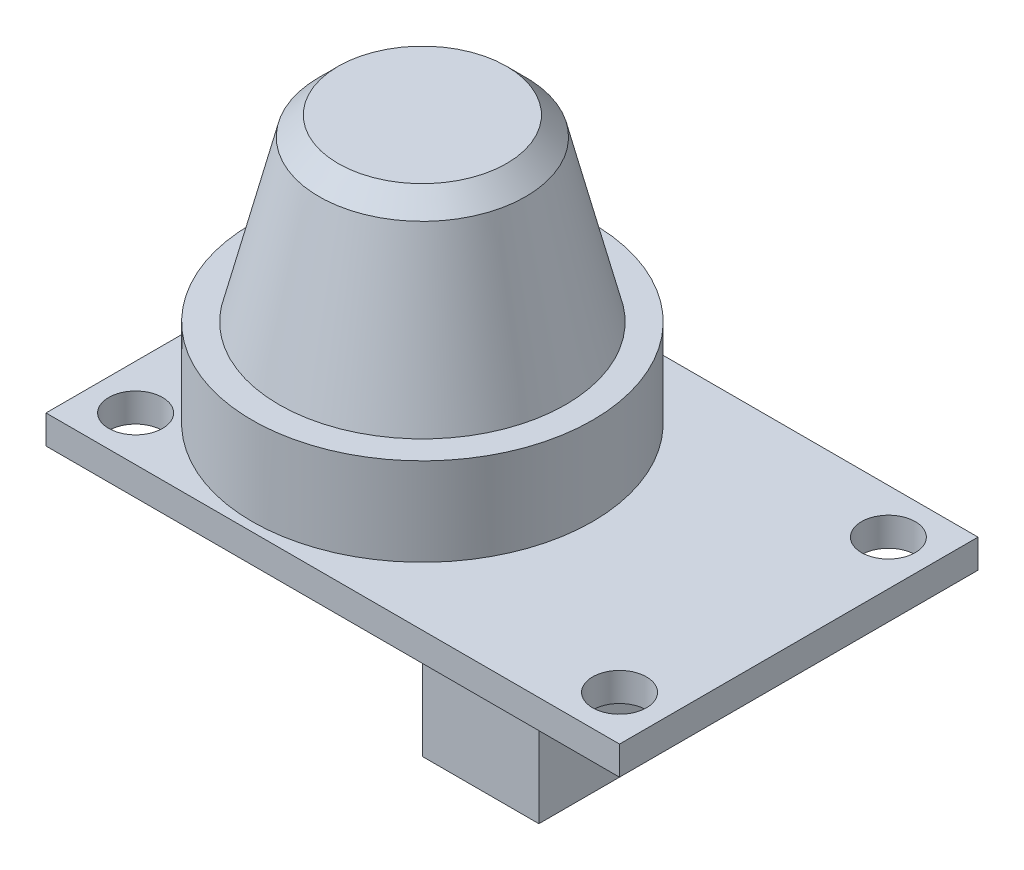
ISO-10303-21;
HEADER;
FILE_DESCRIPTION(('STEP AP214'),'2;1');
FILE_NAME('part.step','',(''),(''),'','','');
FILE_SCHEMA(('AUTOMOTIVE_DESIGN { 1 0 10303 214 1 1 1 1 }'));
ENDSEC;
DATA;
#1=APPLICATION_CONTEXT('core data for automotive mechanical design processes');
#2=APPLICATION_PROTOCOL_DEFINITION('international standard','automotive_design',2000,#1);
#3=PRODUCT_CONTEXT('',#1,'mechanical');
#4=PRODUCT('Part','Part','',(#3));
#5=PRODUCT_RELATED_PRODUCT_CATEGORY('part','',(#4));
#6=PRODUCT_DEFINITION_FORMATION('','',#4);
#7=PRODUCT_DEFINITION_CONTEXT('part definition',#1,'design');
#8=PRODUCT_DEFINITION('design','',#6,#7);
#9=PRODUCT_DEFINITION_SHAPE('','',#8);
#10=(LENGTH_UNIT() NAMED_UNIT(*) SI_UNIT(.MILLI.,.METRE.));
#11=(NAMED_UNIT(*) PLANE_ANGLE_UNIT() SI_UNIT($,.RADIAN.));
#12=(NAMED_UNIT(*) SI_UNIT($,.STERADIAN.) SOLID_ANGLE_UNIT());
#13=UNCERTAINTY_MEASURE_WITH_UNIT(LENGTH_MEASURE(1.E-05),#10,'distance_accuracy_value','');
#14=(GEOMETRIC_REPRESENTATION_CONTEXT(3) GLOBAL_UNCERTAINTY_ASSIGNED_CONTEXT((#13)) GLOBAL_UNIT_ASSIGNED_CONTEXT((#10,
#11,#12)) REPRESENTATION_CONTEXT('',''));
#15=CARTESIAN_POINT('',(0.,0.,0.));
#16=DIRECTION('',(0.,0.,1.));
#17=DIRECTION('',(1.,0.,0.));
#18=AXIS2_PLACEMENT_3D('',#15,#16,#17);
#19=CARTESIAN_POINT('',(0.,0.,0.));
#20=DIRECTION('',(0.,1.,0.));
#21=DIRECTION('',(0.,0.,1.));
#22=AXIS2_PLACEMENT_3D('',#19,#20,#21);
#23=PLANE('',#22);
#24=CARTESIAN_POINT('',(13.5,0.,7.5));
#25=DIRECTION('',(0.,1.,0.));
#26=DIRECTION('',(0.,0.,1.));
#27=AXIS2_PLACEMENT_3D('',#24,#25,#26);
#28=CIRCLE('',#27,1.5);
#29=CARTESIAN_POINT('',(13.5,0.,9.));
#30=VERTEX_POINT('',#29);
#31=EDGE_CURVE('E132',#30,#30,#28,.T.);
#32=ORIENTED_EDGE('',*,*,#31,.T.);
#33=EDGE_LOOP('',(#32));
#34=FACE_BOUND('',#33,.T.);
#35=CARTESIAN_POINT('',(-13.5,0.,7.5));
#36=DIRECTION('',(0.,1.,0.));
#37=DIRECTION('',(0.,0.,1.));
#38=AXIS2_PLACEMENT_3D('',#35,#36,#37);
#39=CIRCLE('',#38,1.5);
#40=CARTESIAN_POINT('',(-13.5,0.,9.));
#41=VERTEX_POINT('',#40);
#42=EDGE_CURVE('E142',#41,#41,#39,.T.);
#43=ORIENTED_EDGE('',*,*,#42,.T.);
#44=EDGE_LOOP('',(#43));
#45=FACE_BOUND('',#44,.T.);
#46=CARTESIAN_POINT('',(13.5,0.,-7.5));
#47=DIRECTION('',(0.,1.,0.));
#48=DIRECTION('',(0.,0.,1.));
#49=AXIS2_PLACEMENT_3D('',#46,#47,#48);
#50=CIRCLE('',#49,1.5);
#51=CARTESIAN_POINT('',(13.5,0.,-6.));
#52=VERTEX_POINT('',#51);
#53=EDGE_CURVE('E147',#52,#52,#50,.T.);
#54=ORIENTED_EDGE('',*,*,#53,.T.);
#55=EDGE_LOOP('',(#54));
#56=FACE_BOUND('',#55,.T.);
#57=CARTESIAN_POINT('',(-13.5,0.,-7.5));
#58=DIRECTION('',(0.,1.,0.));
#59=DIRECTION('',(0.,0.,1.));
#60=AXIS2_PLACEMENT_3D('',#57,#58,#59);
#61=CIRCLE('',#60,1.5);
#62=CARTESIAN_POINT('',(-13.5,0.,-6.));
#63=VERTEX_POINT('',#62);
#64=EDGE_CURVE('E153',#63,#63,#61,.T.);
#65=ORIENTED_EDGE('',*,*,#64,.T.);
#66=EDGE_LOOP('',(#65));
#67=FACE_BOUND('',#66,.T.);
#68=DIRECTION('',(0.,0.,-1.));
#69=VECTOR('',#68,1.);
#70=CARTESIAN_POINT('',(16.,0.,-10.));
#71=LINE('',#70,#69);
#72=CARTESIAN_POINT('',(16.,0.,10.));
#73=VERTEX_POINT('',#72);
#74=CARTESIAN_POINT('',(16.,0.,-10.));
#75=VERTEX_POINT('',#74);
#76=EDGE_CURVE('E159',#73,#75,#71,.T.);
#77=ORIENTED_EDGE('',*,*,#76,.F.);
#78=DIRECTION('',(1.,0.,0.));
#79=VECTOR('',#78,1.);
#80=CARTESIAN_POINT('',(-16.,0.,10.));
#81=LINE('',#80,#79);
#82=CARTESIAN_POINT('',(-16.,0.,10.));
#83=VERTEX_POINT('',#82);
#84=EDGE_CURVE('E166',#83,#73,#81,.T.);
#85=ORIENTED_EDGE('',*,*,#84,.F.);
#86=DIRECTION('',(0.,0.,1.));
#87=VECTOR('',#86,1.);
#88=CARTESIAN_POINT('',(-16.,0.,-10.));
#89=LINE('',#88,#87);
#90=CARTESIAN_POINT('',(-16.,0.,-10.));
#91=VERTEX_POINT('',#90);
#92=EDGE_CURVE('E177',#91,#83,#89,.T.);
#93=ORIENTED_EDGE('',*,*,#92,.F.);
#94=DIRECTION('',(-1.,0.,0.));
#95=VECTOR('',#94,1.);
#96=CARTESIAN_POINT('',(-16.,0.,-10.));
#97=LINE('',#96,#95);
#98=EDGE_CURVE('E175',#75,#91,#97,.T.);
#99=ORIENTED_EDGE('',*,*,#98,.F.);
#100=EDGE_LOOP('',(#77,#85,#93,#99));
#101=FACE_BOUND('',#100,.T.);
#102=DIRECTION('',(0.,0.,1.));
#103=VECTOR('',#102,1.);
#104=CARTESIAN_POINT('',(11.,0.,0.));
#105=LINE('',#104,#103);
#106=CARTESIAN_POINT('',(11.,0.,3.));
#107=VERTEX_POINT('',#106);
#108=CARTESIAN_POINT('',(11.,0.,9.5));
#109=VERTEX_POINT('',#108);
#110=EDGE_CURVE('E131',#107,#109,#105,.T.);
#111=ORIENTED_EDGE('',*,*,#110,.F.);
#112=DIRECTION('',(1.,0.,0.));
#113=VECTOR('',#112,1.);
#114=CARTESIAN_POINT('',(0.,0.,3.));
#115=LINE('',#114,#113);
#116=CARTESIAN_POINT('',(4.5,0.,3.));
#117=VERTEX_POINT('',#116);
#118=EDGE_CURVE('E128',#117,#107,#115,.T.);
#119=ORIENTED_EDGE('',*,*,#118,.F.);
#120=DIRECTION('',(0.,0.,-1.));
#121=VECTOR('',#120,1.);
#122=CARTESIAN_POINT('',(4.5,0.,0.));
#123=LINE('',#122,#121);
#124=CARTESIAN_POINT('',(4.5,0.,9.5));
#125=VERTEX_POINT('',#124);
#126=EDGE_CURVE('E66',#125,#117,#123,.T.);
#127=ORIENTED_EDGE('',*,*,#126,.F.);
#128=DIRECTION('',(-1.,0.,0.));
#129=VECTOR('',#128,1.);
#130=CARTESIAN_POINT('',(0.,0.,9.5));
#131=LINE('',#130,#129);
#132=EDGE_CURVE('E61',#109,#125,#131,.T.);
#133=ORIENTED_EDGE('',*,*,#132,.F.);
#134=EDGE_LOOP('',(#111,#119,#127,#133));
#135=FACE_BOUND('',#134,.T.);
#136=ADVANCED_FACE('F45',(#34,#45,#56,#67,#101,#135),#23,.F.);
#137=CARTESIAN_POINT('',(0.,1.6,0.));
#138=DIRECTION('',(0.,1.,0.));
#139=DIRECTION('',(0.,0.,1.));
#140=AXIS2_PLACEMENT_3D('',#137,#138,#139);
#141=PLANE('',#140);
#142=CARTESIAN_POINT('',(-5.,1.6,0.));
#143=DIRECTION('',(0.,1.,0.));
#144=DIRECTION('',(0.,0.,1.));
#145=AXIS2_PLACEMENT_3D('',#142,#143,#144);
#146=CIRCLE('',#145,9.5);
#147=CARTESIAN_POINT('',(-5.,1.6,9.5));
#148=VERTEX_POINT('',#147);
#149=EDGE_CURVE('E49',#148,#148,#146,.F.);
#150=ORIENTED_EDGE('',*,*,#149,.T.);
#151=EDGE_LOOP('',(#150));
#152=FACE_BOUND('',#151,.T.);
#153=CARTESIAN_POINT('',(-13.5,1.6,7.5));
#154=DIRECTION('',(0.,1.,0.));
#155=DIRECTION('',(0.,0.,1.));
#156=AXIS2_PLACEMENT_3D('',#153,#154,#155);
#157=CIRCLE('',#156,1.5);
#158=CARTESIAN_POINT('',(-13.5,1.6,9.));
#159=VERTEX_POINT('',#158);
#160=EDGE_CURVE('E144',#159,#159,#157,.T.);
#161=ORIENTED_EDGE('',*,*,#160,.F.);
#162=EDGE_LOOP('',(#161));
#163=FACE_BOUND('',#162,.T.);
#164=CARTESIAN_POINT('',(-13.5,1.6,-7.5));
#165=DIRECTION('',(0.,1.,0.));
#166=DIRECTION('',(0.,0.,1.));
#167=AXIS2_PLACEMENT_3D('',#164,#165,#166);
#168=CIRCLE('',#167,1.5);
#169=CARTESIAN_POINT('',(-13.5,1.6,-6.));
#170=VERTEX_POINT('',#169);
#171=EDGE_CURVE('E156',#170,#170,#168,.T.);
#172=ORIENTED_EDGE('',*,*,#171,.F.);
#173=EDGE_LOOP('',(#172));
#174=FACE_BOUND('',#173,.T.);
#175=DIRECTION('',(0.,0.,-1.));
#176=VECTOR('',#175,1.);
#177=CARTESIAN_POINT('',(16.,1.6,-10.));
#178=LINE('',#177,#176);
#179=CARTESIAN_POINT('',(16.,1.6,10.));
#180=VERTEX_POINT('',#179);
#181=CARTESIAN_POINT('',(16.,1.6,-10.));
#182=VERTEX_POINT('',#181);
#183=EDGE_CURVE('E162',#180,#182,#178,.T.);
#184=ORIENTED_EDGE('',*,*,#183,.T.);
#185=DIRECTION('',(-1.,0.,0.));
#186=VECTOR('',#185,1.);
#187=CARTESIAN_POINT('',(-16.,1.6,-10.));
#188=LINE('',#187,#186);
#189=CARTESIAN_POINT('',(-16.,1.6,-10.));
#190=VERTEX_POINT('',#189);
#191=EDGE_CURVE('E165',#182,#190,#188,.T.);
#192=ORIENTED_EDGE('',*,*,#191,.T.);
#193=DIRECTION('',(0.,0.,1.));
#194=VECTOR('',#193,1.);
#195=CARTESIAN_POINT('',(-16.,1.6,-10.));
#196=LINE('',#195,#194);
#197=CARTESIAN_POINT('',(-16.,1.6,10.));
#198=VERTEX_POINT('',#197);
#199=EDGE_CURVE('E168',#190,#198,#196,.T.);
#200=ORIENTED_EDGE('',*,*,#199,.T.);
#201=DIRECTION('',(1.,0.,0.));
#202=VECTOR('',#201,1.);
#203=CARTESIAN_POINT('',(-16.,1.6,10.));
#204=LINE('',#203,#202);
#205=EDGE_CURVE('E170',#198,#180,#204,.T.);
#206=ORIENTED_EDGE('',*,*,#205,.T.);
#207=EDGE_LOOP('',(#184,#192,#200,#206));
#208=FACE_BOUND('',#207,.T.);
#209=CARTESIAN_POINT('',(13.5,1.6,-7.5));
#210=DIRECTION('',(0.,1.,0.));
#211=DIRECTION('',(0.,0.,1.));
#212=AXIS2_PLACEMENT_3D('',#209,#210,#211);
#213=CIRCLE('',#212,1.5);
#214=CARTESIAN_POINT('',(13.5,1.6,-6.));
#215=VERTEX_POINT('',#214);
#216=EDGE_CURVE('E150',#215,#215,#213,.T.);
#217=ORIENTED_EDGE('',*,*,#216,.F.);
#218=EDGE_LOOP('',(#217));
#219=FACE_BOUND('',#218,.T.);
#220=CARTESIAN_POINT('',(13.5,1.6,7.5));
#221=DIRECTION('',(0.,1.,0.));
#222=DIRECTION('',(0.,0.,1.));
#223=AXIS2_PLACEMENT_3D('',#220,#221,#222);
#224=CIRCLE('',#223,1.5);
#225=CARTESIAN_POINT('',(13.5,1.6,9.));
#226=VERTEX_POINT('',#225);
#227=EDGE_CURVE('E135',#226,#226,#224,.T.);
#228=ORIENTED_EDGE('',*,*,#227,.F.);
#229=EDGE_LOOP('',(#228));
#230=FACE_BOUND('',#229,.T.);
#231=ADVANCED_FACE('F204',(#152,#163,#174,#208,#219,#230),#141,.T.);
#232=CARTESIAN_POINT('',(16.,1.6,-10.));
#233=DIRECTION('',(-1.,0.,0.));
#234=DIRECTION('',(0.,0.,1.));
#235=AXIS2_PLACEMENT_3D('',#232,#233,#234);
#236=PLANE('',#235);
#237=ORIENTED_EDGE('',*,*,#76,.T.);
#238=DIRECTION('',(0.,-1.,0.));
#239=VECTOR('',#238,1.);
#240=CARTESIAN_POINT('',(16.,1.6,-10.));
#241=LINE('',#240,#239);
#242=EDGE_CURVE('E11',#182,#75,#241,.T.);
#243=ORIENTED_EDGE('',*,*,#242,.F.);
#244=ORIENTED_EDGE('',*,*,#183,.F.);
#245=DIRECTION('',(0.,-1.,0.));
#246=VECTOR('',#245,1.);
#247=CARTESIAN_POINT('',(16.,1.6,10.));
#248=LINE('',#247,#246);
#249=EDGE_CURVE('E172',#180,#73,#248,.T.);
#250=ORIENTED_EDGE('',*,*,#249,.T.);
#251=EDGE_LOOP('',(#237,#243,#244,#250));
#252=FACE_BOUND('',#251,.T.);
#253=ADVANCED_FACE('F47',(#252),#236,.F.);
#254=CARTESIAN_POINT('',(-16.,1.6,-10.));
#255=DIRECTION('',(0.,0.,1.));
#256=DIRECTION('',(1.,0.,0.));
#257=AXIS2_PLACEMENT_3D('',#254,#255,#256);
#258=PLANE('',#257);
#259=ORIENTED_EDGE('',*,*,#98,.T.);
#260=DIRECTION('',(0.,-1.,0.));
#261=VECTOR('',#260,1.);
#262=CARTESIAN_POINT('',(-16.,1.6,-10.));
#263=LINE('',#262,#261);
#264=EDGE_CURVE('E54',#190,#91,#263,.T.);
#265=ORIENTED_EDGE('',*,*,#264,.F.);
#266=ORIENTED_EDGE('',*,*,#191,.F.);
#267=ORIENTED_EDGE('',*,*,#242,.T.);
#268=EDGE_LOOP('',(#259,#265,#266,#267));
#269=FACE_BOUND('',#268,.T.);
#270=ADVANCED_FACE('F206',(#269),#258,.F.);
#271=CARTESIAN_POINT('',(-16.,1.6,-10.));
#272=DIRECTION('',(1.,0.,0.));
#273=DIRECTION('',(0.,0.,-1.));
#274=AXIS2_PLACEMENT_3D('',#271,#272,#273);
#275=PLANE('',#274);
#276=ORIENTED_EDGE('',*,*,#92,.T.);
#277=DIRECTION('',(0.,-1.,0.));
#278=VECTOR('',#277,1.);
#279=CARTESIAN_POINT('',(-16.,1.6,10.));
#280=LINE('',#279,#278);
#281=EDGE_CURVE('E182',#198,#83,#280,.T.);
#282=ORIENTED_EDGE('',*,*,#281,.F.);
#283=ORIENTED_EDGE('',*,*,#199,.F.);
#284=ORIENTED_EDGE('',*,*,#264,.T.);
#285=EDGE_LOOP('',(#276,#282,#283,#284));
#286=FACE_BOUND('',#285,.T.);
#287=ADVANCED_FACE('F190',(#286),#275,.F.);
#288=CARTESIAN_POINT('',(-16.,1.6,10.));
#289=DIRECTION('',(0.,0.,-1.));
#290=DIRECTION('',(-1.,0.,0.));
#291=AXIS2_PLACEMENT_3D('',#288,#289,#290);
#292=PLANE('',#291);
#293=ORIENTED_EDGE('',*,*,#84,.T.);
#294=ORIENTED_EDGE('',*,*,#249,.F.);
#295=ORIENTED_EDGE('',*,*,#205,.F.);
#296=ORIENTED_EDGE('',*,*,#281,.T.);
#297=EDGE_LOOP('',(#293,#294,#295,#296));
#298=FACE_BOUND('',#297,.T.);
#299=ADVANCED_FACE('F198',(#298),#292,.F.);
#300=CARTESIAN_POINT('',(-13.5,1.6,-7.5));
#301=DIRECTION('',(0.,-1.,0.));
#302=DIRECTION('',(0.,0.,-1.));
#303=AXIS2_PLACEMENT_3D('',#300,#301,#302);
#304=CYLINDRICAL_SURFACE('',#303,1.5);
#305=ORIENTED_EDGE('',*,*,#171,.T.);
#306=EDGE_LOOP('',(#305));
#307=FACE_BOUND('',#306,.T.);
#308=ORIENTED_EDGE('',*,*,#64,.F.);
#309=EDGE_LOOP('',(#308));
#310=FACE_BOUND('',#309,.T.);
#311=ADVANCED_FACE('F225',(#307,#310),#304,.F.);
#312=CARTESIAN_POINT('',(13.5,1.6,-7.5));
#313=DIRECTION('',(0.,-1.,0.));
#314=DIRECTION('',(0.,0.,-1.));
#315=AXIS2_PLACEMENT_3D('',#312,#313,#314);
#316=CYLINDRICAL_SURFACE('',#315,1.5);
#317=ORIENTED_EDGE('',*,*,#216,.T.);
#318=EDGE_LOOP('',(#317));
#319=FACE_BOUND('',#318,.T.);
#320=ORIENTED_EDGE('',*,*,#53,.F.);
#321=EDGE_LOOP('',(#320));
#322=FACE_BOUND('',#321,.T.);
#323=ADVANCED_FACE('F229',(#319,#322),#316,.F.);
#324=CARTESIAN_POINT('',(-13.5,1.6,7.5));
#325=DIRECTION('',(0.,-1.,0.));
#326=DIRECTION('',(0.,0.,-1.));
#327=AXIS2_PLACEMENT_3D('',#324,#325,#326);
#328=CYLINDRICAL_SURFACE('',#327,1.5);
#329=ORIENTED_EDGE('',*,*,#160,.T.);
#330=EDGE_LOOP('',(#329));
#331=FACE_BOUND('',#330,.T.);
#332=ORIENTED_EDGE('',*,*,#42,.F.);
#333=EDGE_LOOP('',(#332));
#334=FACE_BOUND('',#333,.T.);
#335=ADVANCED_FACE('F234',(#331,#334),#328,.F.);
#336=CARTESIAN_POINT('',(13.5,1.6,7.5));
#337=DIRECTION('',(0.,-1.,0.));
#338=DIRECTION('',(0.,0.,-1.));
#339=AXIS2_PLACEMENT_3D('',#336,#337,#338);
#340=CYLINDRICAL_SURFACE('',#339,1.5);
#341=ORIENTED_EDGE('',*,*,#227,.T.);
#342=EDGE_LOOP('',(#341));
#343=FACE_BOUND('',#342,.T.);
#344=ORIENTED_EDGE('',*,*,#31,.F.);
#345=EDGE_LOOP('',(#344));
#346=FACE_BOUND('',#345,.T.);
#347=ADVANCED_FACE('F241',(#343,#346),#340,.F.);
#348=CARTESIAN_POINT('',(11.,-5.,0.));
#349=DIRECTION('',(-1.,0.,0.));
#350=DIRECTION('',(0.,0.,1.));
#351=AXIS2_PLACEMENT_3D('',#348,#349,#350);
#352=PLANE('',#351);
#353=ORIENTED_EDGE('',*,*,#110,.T.);
#354=DIRECTION('',(0.,1.,0.));
#355=VECTOR('',#354,1.);
#356=CARTESIAN_POINT('',(11.,-5.,9.5));
#357=LINE('',#356,#355);
#358=CARTESIAN_POINT('',(11.,-5.,9.5));
#359=VERTEX_POINT('',#358);
#360=EDGE_CURVE('E112',#359,#109,#357,.T.);
#361=ORIENTED_EDGE('',*,*,#360,.F.);
#362=DIRECTION('',(0.,0.,1.));
#363=VECTOR('',#362,1.);
#364=CARTESIAN_POINT('',(11.,-5.,0.));
#365=LINE('',#364,#363);
#366=CARTESIAN_POINT('',(11.,-5.,3.));
#367=VERTEX_POINT('',#366);
#368=EDGE_CURVE('E119',#367,#359,#365,.T.);
#369=ORIENTED_EDGE('',*,*,#368,.F.);
#370=DIRECTION('',(0.,1.,0.));
#371=VECTOR('',#370,1.);
#372=CARTESIAN_POINT('',(11.,-5.,3.));
#373=LINE('',#372,#371);
#374=EDGE_CURVE('E299',#367,#107,#373,.T.);
#375=ORIENTED_EDGE('',*,*,#374,.T.);
#376=EDGE_LOOP('',(#353,#361,#369,#375));
#377=FACE_BOUND('',#376,.T.);
#378=ADVANCED_FACE('F130',(#377),#352,.F.);
#379=CARTESIAN_POINT('',(0.,-5.,9.5));
#380=DIRECTION('',(0.,0.,-1.));
#381=DIRECTION('',(-1.,0.,0.));
#382=AXIS2_PLACEMENT_3D('',#379,#380,#381);
#383=PLANE('',#382);
#384=ORIENTED_EDGE('',*,*,#132,.T.);
#385=DIRECTION('',(0.,1.,0.));
#386=VECTOR('',#385,1.);
#387=CARTESIAN_POINT('',(4.5,-5.,9.5));
#388=LINE('',#387,#386);
#389=CARTESIAN_POINT('',(4.5,-5.,9.5));
#390=VERTEX_POINT('',#389);
#391=EDGE_CURVE('E115',#390,#125,#388,.T.);
#392=ORIENTED_EDGE('',*,*,#391,.F.);
#393=DIRECTION('',(-1.,0.,0.));
#394=VECTOR('',#393,1.);
#395=CARTESIAN_POINT('',(0.,-5.,9.5));
#396=LINE('',#395,#394);
#397=EDGE_CURVE('E108',#359,#390,#396,.T.);
#398=ORIENTED_EDGE('',*,*,#397,.F.);
#399=ORIENTED_EDGE('',*,*,#360,.T.);
#400=EDGE_LOOP('',(#384,#392,#398,#399));
#401=FACE_BOUND('',#400,.T.);
#402=ADVANCED_FACE('F110',(#401),#383,.F.);
#403=CARTESIAN_POINT('',(4.5,-5.,0.));
#404=DIRECTION('',(1.,0.,0.));
#405=DIRECTION('',(0.,0.,-1.));
#406=AXIS2_PLACEMENT_3D('',#403,#404,#405);
#407=PLANE('',#406);
#408=ORIENTED_EDGE('',*,*,#126,.T.);
#409=DIRECTION('',(0.,1.,0.));
#410=VECTOR('',#409,1.);
#411=CARTESIAN_POINT('',(4.5,-5.,3.));
#412=LINE('',#411,#410);
#413=CARTESIAN_POINT('',(4.5,-5.,3.));
#414=VERTEX_POINT('',#413);
#415=EDGE_CURVE('E137',#414,#117,#412,.T.);
#416=ORIENTED_EDGE('',*,*,#415,.F.);
#417=DIRECTION('',(0.,0.,-1.));
#418=VECTOR('',#417,1.);
#419=CARTESIAN_POINT('',(4.5,-5.,0.));
#420=LINE('',#419,#418);
#421=EDGE_CURVE('E118',#390,#414,#420,.T.);
#422=ORIENTED_EDGE('',*,*,#421,.F.);
#423=ORIENTED_EDGE('',*,*,#391,.T.);
#424=EDGE_LOOP('',(#408,#416,#422,#423));
#425=FACE_BOUND('',#424,.T.);
#426=ADVANCED_FACE('F250',(#425),#407,.F.);
#427=CARTESIAN_POINT('',(0.,-5.,3.));
#428=DIRECTION('',(0.,0.,1.));
#429=DIRECTION('',(1.,0.,0.));
#430=AXIS2_PLACEMENT_3D('',#427,#428,#429);
#431=PLANE('',#430);
#432=ORIENTED_EDGE('',*,*,#118,.T.);
#433=ORIENTED_EDGE('',*,*,#374,.F.);
#434=DIRECTION('',(1.,0.,0.));
#435=VECTOR('',#434,1.);
#436=CARTESIAN_POINT('',(0.,-5.,3.));
#437=LINE('',#436,#435);
#438=EDGE_CURVE('E124',#414,#367,#437,.T.);
#439=ORIENTED_EDGE('',*,*,#438,.F.);
#440=ORIENTED_EDGE('',*,*,#415,.T.);
#441=EDGE_LOOP('',(#432,#433,#439,#440));
#442=FACE_BOUND('',#441,.T.);
#443=ADVANCED_FACE('F253',(#442),#431,.F.);
#444=CARTESIAN_POINT('',(0.,-5.,0.));
#445=DIRECTION('',(0.,-1.,0.));
#446=DIRECTION('',(0.,0.,-1.));
#447=AXIS2_PLACEMENT_3D('',#444,#445,#446);
#448=PLANE('',#447);
#449=ORIENTED_EDGE('',*,*,#368,.T.);
#450=ORIENTED_EDGE('',*,*,#397,.T.);
#451=ORIENTED_EDGE('',*,*,#421,.T.);
#452=ORIENTED_EDGE('',*,*,#438,.T.);
#453=EDGE_LOOP('',(#449,#450,#451,#452));
#454=FACE_BOUND('',#453,.T.);
#455=ADVANCED_FACE('F122',(#454),#448,.T.);
#456=CARTESIAN_POINT('',(-5.,16.5,0.));
#457=DIRECTION('',(0.,-1.,0.));
#458=DIRECTION('',(0.,0.,-1.));
#459=AXIS2_PLACEMENT_3D('',#456,#457,#458);
#460=CYLINDRICAL_SURFACE('',#459,9.5);
#461=CARTESIAN_POINT('',(-4.99999999999997,6.49999999999995,0.));
#462=DIRECTION('',(0.,-1.,0.));
#463=DIRECTION('',(1.,0.,0.));
#464=AXIS2_PLACEMENT_3D('',#461,#462,#463);
#465=CIRCLE('',#464,9.49999999999997);
#466=CARTESIAN_POINT('',(4.5,6.49999999999998,0.));
#467=VERTEX_POINT('',#466);
#468=EDGE_CURVE('E284',#467,#467,#465,.T.);
#469=ORIENTED_EDGE('',*,*,#468,.T.);
#470=EDGE_LOOP('',(#469));
#471=FACE_BOUND('',#470,.T.);
#472=ORIENTED_EDGE('',*,*,#149,.F.);
#473=EDGE_LOOP('',(#472));
#474=FACE_BOUND('',#473,.T.);
#475=ADVANCED_FACE('F260',(#471,#474),#460,.T.);
#476=CARTESIAN_POINT('',(-5.,15.4333333333333,0.));
#477=DIRECTION('',(0.,-1.,0.));
#478=DIRECTION('',(1.,0.,0.));
#479=AXIS2_PLACEMENT_3D('',#476,#477,#478);
#480=CONICAL_SURFACE('',#479,5.76666666666666,0.785398163397447);
#481=CARTESIAN_POINT('',(-5.,16.5,0.));
#482=DIRECTION('',(0.,-1.,0.));
#483=DIRECTION('',(1.,0.,0.));
#484=AXIS2_PLACEMENT_3D('',#481,#482,#483);
#485=CIRCLE('',#484,4.7);
#486=CARTESIAN_POINT('',(-0.300000000000003,16.5,0.));
#487=VERTEX_POINT('',#486);
#488=EDGE_CURVE('E291',#487,#487,#485,.T.);
#489=ORIENTED_EDGE('',*,*,#488,.T.);
#490=EDGE_LOOP('',(#489));
#491=FACE_BOUND('',#490,.T.);
#492=CARTESIAN_POINT('',(-5.,15.4333333333333,0.));
#493=DIRECTION('',(0.,-1.,0.));
#494=DIRECTION('',(1.,0.,0.));
#495=AXIS2_PLACEMENT_3D('',#492,#493,#494);
#496=CIRCLE('',#495,5.76666666666666);
#497=CARTESIAN_POINT('',(0.766666666666658,15.4333333333333,0.));
#498=VERTEX_POINT('',#497);
#499=EDGE_CURVE('E288',#498,#498,#496,.T.);
#500=ORIENTED_EDGE('',*,*,#499,.F.);
#501=EDGE_LOOP('',(#500));
#502=FACE_BOUND('',#501,.T.);
#503=ADVANCED_FACE('F263',(#491,#502),#480,.T.);
#504=CARTESIAN_POINT('',(-5.,15.4333333333333,0.));
#505=DIRECTION('',(0.,-1.,0.));
#506=DIRECTION('',(1.,0.,0.));
#507=AXIS2_PLACEMENT_3D('',#504,#505,#506);
#508=CONICAL_SURFACE('',#507,5.76666666666666,0.244978663126861);
#509=CARTESIAN_POINT('',(-4.99999999999997,6.49999999999995,0.));
#510=DIRECTION('',(0.,-1.,0.));
#511=DIRECTION('',(1.,0.,0.));
#512=AXIS2_PLACEMENT_3D('',#509,#510,#511);
#513=CIRCLE('',#512,7.99999999999997);
#514=CARTESIAN_POINT('',(3.,6.49999999999998,0.));
#515=VERTEX_POINT('',#514);
#516=EDGE_CURVE('E287',#515,#515,#513,.T.);
#517=ORIENTED_EDGE('',*,*,#516,.F.);
#518=EDGE_LOOP('',(#517));
#519=FACE_BOUND('',#518,.T.);
#520=ORIENTED_EDGE('',*,*,#499,.T.);
#521=EDGE_LOOP('',(#520));
#522=FACE_BOUND('',#521,.T.);
#523=ADVANCED_FACE('F272',(#519,#522),#508,.T.);
#524=CARTESIAN_POINT('',(0.,6.49999999999999,0.));
#525=DIRECTION('',(0.,-1.,0.));
#526=DIRECTION('',(1.,0.,0.));
#527=AXIS2_PLACEMENT_3D('',#524,#525,#526);
#528=PLANE('',#527);
#529=ORIENTED_EDGE('',*,*,#468,.F.);
#530=EDGE_LOOP('',(#529));
#531=FACE_BOUND('',#530,.T.);
#532=ORIENTED_EDGE('',*,*,#516,.T.);
#533=EDGE_LOOP('',(#532));
#534=FACE_BOUND('',#533,.T.);
#535=ADVANCED_FACE('F268',(#531,#534),#528,.F.);
#536=CARTESIAN_POINT('',(-5.,16.5,0.));
#537=DIRECTION('',(0.,1.,0.));
#538=DIRECTION('',(0.,0.,1.));
#539=AXIS2_PLACEMENT_3D('',#536,#537,#538);
#540=PLANE('',#539);
#541=ORIENTED_EDGE('',*,*,#488,.F.);
#542=EDGE_LOOP('',(#541));
#543=FACE_BOUND('',#542,.T.);
#544=ADVANCED_FACE('F265',(#543),#540,.T.);
#545=CLOSED_SHELL('',(#136,#231,#253,#270,#287,#299,#311,#323,#335,#347,#378,#402,#426,#443,
#455,#475,#503,#523,#535,#544));
#546=MANIFOLD_SOLID_BREP('B2',#545);
#547=ADVANCED_BREP_SHAPE_REPRESENTATION('',(#18,#546),#14);
#548=SHAPE_DEFINITION_REPRESENTATION(#9,#547);
ENDSEC;
END-ISO-10303-21;
